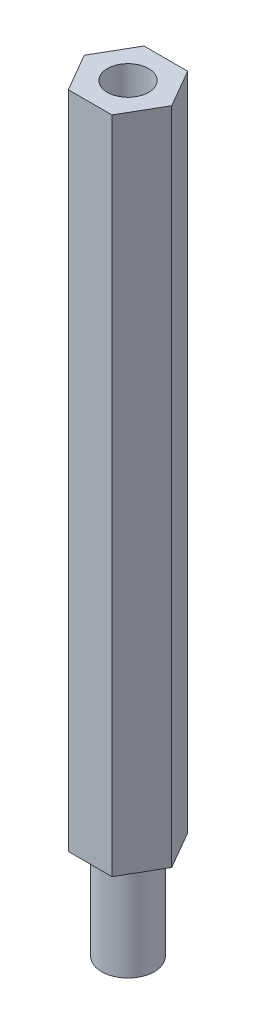
ISO-10303-21;
HEADER;
FILE_DESCRIPTION(('STEP AP214'),'2;1');
FILE_NAME('part.step','',(''),(''),'','','');
FILE_SCHEMA(('AUTOMOTIVE_DESIGN { 1 0 10303 214 1 1 1 1 }'));
ENDSEC;
DATA;
#1=APPLICATION_CONTEXT('core data for automotive mechanical design processes');
#2=APPLICATION_PROTOCOL_DEFINITION('international standard','automotive_design',2000,#1);
#3=PRODUCT_CONTEXT('',#1,'mechanical');
#4=PRODUCT('Part','Part','',(#3));
#5=PRODUCT_RELATED_PRODUCT_CATEGORY('part','',(#4));
#6=PRODUCT_DEFINITION_FORMATION('','',#4);
#7=PRODUCT_DEFINITION_CONTEXT('part definition',#1,'design');
#8=PRODUCT_DEFINITION('design','',#6,#7);
#9=PRODUCT_DEFINITION_SHAPE('','',#8);
#10=(LENGTH_UNIT() NAMED_UNIT(*) SI_UNIT(.MILLI.,.METRE.));
#11=(NAMED_UNIT(*) PLANE_ANGLE_UNIT() SI_UNIT($,.RADIAN.));
#12=(NAMED_UNIT(*) SI_UNIT($,.STERADIAN.) SOLID_ANGLE_UNIT());
#13=UNCERTAINTY_MEASURE_WITH_UNIT(LENGTH_MEASURE(1.E-05),#10,'distance_accuracy_value','');
#14=(GEOMETRIC_REPRESENTATION_CONTEXT(3) GLOBAL_UNCERTAINTY_ASSIGNED_CONTEXT((#13)) GLOBAL_UNIT_ASSIGNED_CONTEXT((#10,
#11,#12)) REPRESENTATION_CONTEXT('',''));
#15=CARTESIAN_POINT('',(0.,0.,0.));
#16=DIRECTION('',(0.,0.,1.));
#17=DIRECTION('',(1.,0.,0.));
#18=AXIS2_PLACEMENT_3D('',#15,#16,#17);
#19=CARTESIAN_POINT('',(-1.325,40.,2.29496732002876));
#20=DIRECTION('',(0.,0.,-1.));
#21=DIRECTION('',(-1.,0.,0.));
#22=AXIS2_PLACEMENT_3D('',#19,#20,#21);
#23=PLANE('',#22);
#24=DIRECTION('',(1.,0.,0.));
#25=VECTOR('',#24,1.);
#26=CARTESIAN_POINT('',(-1.325,0.,2.29496732002876));
#27=LINE('',#26,#25);
#28=CARTESIAN_POINT('',(-1.325,0.,2.29496732002876));
#29=VERTEX_POINT('',#28);
#30=CARTESIAN_POINT('',(1.325,0.,2.29496732002876));
#31=VERTEX_POINT('',#30);
#32=EDGE_CURVE('E122',#29,#31,#27,.T.);
#33=ORIENTED_EDGE('',*,*,#32,.T.);
#34=DIRECTION('',(0.,-1.,0.));
#35=VECTOR('',#34,1.);
#36=CARTESIAN_POINT('',(1.325,40.,2.29496732002876));
#37=LINE('',#36,#35);
#38=CARTESIAN_POINT('',(1.325,40.,2.29496732002876));
#39=VERTEX_POINT('',#38);
#40=EDGE_CURVE('E45',#39,#31,#37,.T.);
#41=ORIENTED_EDGE('',*,*,#40,.F.);
#42=DIRECTION('',(1.,0.,0.));
#43=VECTOR('',#42,1.);
#44=CARTESIAN_POINT('',(-1.325,40.,2.29496732002876));
#45=LINE('',#44,#43);
#46=CARTESIAN_POINT('',(-1.325,40.,2.29496732002876));
#47=VERTEX_POINT('',#46);
#48=EDGE_CURVE('E133',#47,#39,#45,.T.);
#49=ORIENTED_EDGE('',*,*,#48,.F.);
#50=DIRECTION('',(0.,-1.,0.));
#51=VECTOR('',#50,1.);
#52=CARTESIAN_POINT('',(-1.325,40.,2.29496732002876));
#53=LINE('',#52,#51);
#54=EDGE_CURVE('E118',#47,#29,#53,.T.);
#55=ORIENTED_EDGE('',*,*,#54,.T.);
#56=EDGE_LOOP('',(#33,#41,#49,#55));
#57=FACE_BOUND('',#56,.T.);
#58=ADVANCED_FACE('F37',(#57),#23,.F.);
#59=CARTESIAN_POINT('',(1.325,40.,2.29496732002876));
#60=DIRECTION('',(-0.866025403784439,0.,-0.5));
#61=DIRECTION('',(-0.5,0.,0.866025403784439));
#62=AXIS2_PLACEMENT_3D('',#59,#60,#61);
#63=PLANE('',#62);
#64=DIRECTION('',(0.5,0.,-0.866025403784439));
#65=VECTOR('',#64,1.);
#66=CARTESIAN_POINT('',(1.325,0.,2.29496732002876));
#67=LINE('',#66,#65);
#68=CARTESIAN_POINT('',(2.65,0.,0.));
#69=VERTEX_POINT('',#68);
#70=EDGE_CURVE('E125',#31,#69,#67,.T.);
#71=ORIENTED_EDGE('',*,*,#70,.T.);
#72=DIRECTION('',(0.,-1.,0.));
#73=VECTOR('',#72,1.);
#74=CARTESIAN_POINT('',(2.65,40.,0.));
#75=LINE('',#74,#73);
#76=CARTESIAN_POINT('',(2.65,40.,0.));
#77=VERTEX_POINT('',#76);
#78=EDGE_CURVE('E137',#77,#69,#75,.T.);
#79=ORIENTED_EDGE('',*,*,#78,.F.);
#80=DIRECTION('',(0.5,0.,-0.866025403784439));
#81=VECTOR('',#80,1.);
#82=CARTESIAN_POINT('',(1.325,40.,2.29496732002876));
#83=LINE('',#82,#81);
#84=EDGE_CURVE('E91',#39,#77,#83,.T.);
#85=ORIENTED_EDGE('',*,*,#84,.F.);
#86=ORIENTED_EDGE('',*,*,#40,.T.);
#87=EDGE_LOOP('',(#71,#79,#85,#86));
#88=FACE_BOUND('',#87,.T.);
#89=ADVANCED_FACE('F140',(#88),#63,.F.);
#90=CARTESIAN_POINT('',(2.65,40.,0.));
#91=DIRECTION('',(-0.866025403784438,0.,0.5));
#92=DIRECTION('',(0.5,0.,0.866025403784439));
#93=AXIS2_PLACEMENT_3D('',#90,#91,#92);
#94=PLANE('',#93);
#95=DIRECTION('',(-0.5,0.,-0.866025403784439));
#96=VECTOR('',#95,1.);
#97=CARTESIAN_POINT('',(2.65,0.,0.));
#98=LINE('',#97,#96);
#99=CARTESIAN_POINT('',(1.325,0.,-2.29496732002876));
#100=VERTEX_POINT('',#99);
#101=EDGE_CURVE('E128',#69,#100,#98,.T.);
#102=ORIENTED_EDGE('',*,*,#101,.T.);
#103=DIRECTION('',(0.,-1.,0.));
#104=VECTOR('',#103,1.);
#105=CARTESIAN_POINT('',(1.325,40.,-2.29496732002876));
#106=LINE('',#105,#104);
#107=CARTESIAN_POINT('',(1.325,40.,-2.29496732002876));
#108=VERTEX_POINT('',#107);
#109=EDGE_CURVE('E113',#108,#100,#106,.T.);
#110=ORIENTED_EDGE('',*,*,#109,.F.);
#111=DIRECTION('',(-0.5,0.,-0.866025403784439));
#112=VECTOR('',#111,1.);
#113=CARTESIAN_POINT('',(2.65,40.,0.));
#114=LINE('',#113,#112);
#115=EDGE_CURVE('E104',#77,#108,#114,.T.);
#116=ORIENTED_EDGE('',*,*,#115,.F.);
#117=ORIENTED_EDGE('',*,*,#78,.T.);
#118=EDGE_LOOP('',(#102,#110,#116,#117));
#119=FACE_BOUND('',#118,.T.);
#120=ADVANCED_FACE('F148',(#119),#94,.F.);
#121=CARTESIAN_POINT('',(1.325,40.,-2.29496732002876));
#122=DIRECTION('',(0.,0.,1.));
#123=DIRECTION('',(1.,0.,0.));
#124=AXIS2_PLACEMENT_3D('',#121,#122,#123);
#125=PLANE('',#124);
#126=DIRECTION('',(-1.,0.,0.));
#127=VECTOR('',#126,1.);
#128=CARTESIAN_POINT('',(1.325,0.,-2.29496732002876));
#129=LINE('',#128,#127);
#130=CARTESIAN_POINT('',(-1.325,0.,-2.29496732002876));
#131=VERTEX_POINT('',#130);
#132=EDGE_CURVE('E112',#100,#131,#129,.T.);
#133=ORIENTED_EDGE('',*,*,#132,.T.);
#134=DIRECTION('',(0.,-1.,0.));
#135=VECTOR('',#134,1.);
#136=CARTESIAN_POINT('',(-1.325,40.,-2.29496732002876));
#137=LINE('',#136,#135);
#138=CARTESIAN_POINT('',(-1.325,40.,-2.29496732002876));
#139=VERTEX_POINT('',#138);
#140=EDGE_CURVE('E109',#139,#131,#137,.T.);
#141=ORIENTED_EDGE('',*,*,#140,.F.);
#142=DIRECTION('',(-1.,0.,0.));
#143=VECTOR('',#142,1.);
#144=CARTESIAN_POINT('',(1.325,40.,-2.29496732002876));
#145=LINE('',#144,#143);
#146=EDGE_CURVE('E98',#108,#139,#145,.T.);
#147=ORIENTED_EDGE('',*,*,#146,.F.);
#148=ORIENTED_EDGE('',*,*,#109,.T.);
#149=EDGE_LOOP('',(#133,#141,#147,#148));
#150=FACE_BOUND('',#149,.T.);
#151=ADVANCED_FACE('F110',(#150),#125,.F.);
#152=CARTESIAN_POINT('',(-1.325,40.,-2.29496732002876));
#153=DIRECTION('',(0.866025403784439,0.,0.5));
#154=DIRECTION('',(0.5,0.,-0.866025403784439));
#155=AXIS2_PLACEMENT_3D('',#152,#153,#154);
#156=PLANE('',#155);
#157=DIRECTION('',(-0.5,0.,0.866025403784439));
#158=VECTOR('',#157,1.);
#159=CARTESIAN_POINT('',(-1.325,0.,-2.29496732002876));
#160=LINE('',#159,#158);
#161=CARTESIAN_POINT('',(-2.65,0.,0.));
#162=VERTEX_POINT('',#161);
#163=EDGE_CURVE('E76',#131,#162,#160,.T.);
#164=ORIENTED_EDGE('',*,*,#163,.T.);
#165=DIRECTION('',(0.,-1.,0.));
#166=VECTOR('',#165,1.);
#167=CARTESIAN_POINT('',(-2.65,40.,0.));
#168=LINE('',#167,#166);
#169=CARTESIAN_POINT('',(-2.65,40.,0.));
#170=VERTEX_POINT('',#169);
#171=EDGE_CURVE('E114',#170,#162,#168,.T.);
#172=ORIENTED_EDGE('',*,*,#171,.F.);
#173=DIRECTION('',(-0.5,0.,0.866025403784439));
#174=VECTOR('',#173,1.);
#175=CARTESIAN_POINT('',(-1.325,40.,-2.29496732002876));
#176=LINE('',#175,#174);
#177=EDGE_CURVE('E102',#139,#170,#176,.T.);
#178=ORIENTED_EDGE('',*,*,#177,.F.);
#179=ORIENTED_EDGE('',*,*,#140,.T.);
#180=EDGE_LOOP('',(#164,#172,#178,#179));
#181=FACE_BOUND('',#180,.T.);
#182=ADVANCED_FACE('F116',(#181),#156,.F.);
#183=CARTESIAN_POINT('',(-2.65,40.,0.));
#184=DIRECTION('',(0.866025403784438,0.,-0.5));
#185=DIRECTION('',(-0.5,0.,-0.866025403784439));
#186=AXIS2_PLACEMENT_3D('',#183,#184,#185);
#187=PLANE('',#186);
#188=DIRECTION('',(0.5,0.,0.866025403784439));
#189=VECTOR('',#188,1.);
#190=CARTESIAN_POINT('',(-2.65,0.,0.));
#191=LINE('',#190,#189);
#192=EDGE_CURVE('E82',#162,#29,#191,.T.);
#193=ORIENTED_EDGE('',*,*,#192,.T.);
#194=ORIENTED_EDGE('',*,*,#54,.F.);
#195=DIRECTION('',(0.5,0.,0.866025403784439));
#196=VECTOR('',#195,1.);
#197=CARTESIAN_POINT('',(-2.65,40.,0.));
#198=LINE('',#197,#196);
#199=EDGE_CURVE('E53',#170,#47,#198,.T.);
#200=ORIENTED_EDGE('',*,*,#199,.F.);
#201=ORIENTED_EDGE('',*,*,#171,.T.);
#202=EDGE_LOOP('',(#193,#194,#200,#201));
#203=FACE_BOUND('',#202,.T.);
#204=ADVANCED_FACE('F171',(#203),#187,.F.);
#205=CARTESIAN_POINT('',(0.,40.,0.));
#206=DIRECTION('',(0.,1.,0.));
#207=DIRECTION('',(0.,0.,1.));
#208=AXIS2_PLACEMENT_3D('',#205,#206,#207);
#209=PLANE('',#208);
#210=CARTESIAN_POINT('',(0.,40.,0.));
#211=DIRECTION('',(0.,1.,0.));
#212=DIRECTION('',(0.,0.,1.));
#213=AXIS2_PLACEMENT_3D('',#210,#211,#212);
#214=CIRCLE('',#213,1.25);
#215=CARTESIAN_POINT('',(0.,40.,1.25));
#216=VERTEX_POINT('',#215);
#217=EDGE_CURVE('E155',#216,#216,#214,.T.);
#218=ORIENTED_EDGE('',*,*,#217,.F.);
#219=EDGE_LOOP('',(#218));
#220=FACE_BOUND('',#219,.T.);
#221=ORIENTED_EDGE('',*,*,#48,.T.);
#222=ORIENTED_EDGE('',*,*,#84,.T.);
#223=ORIENTED_EDGE('',*,*,#115,.T.);
#224=ORIENTED_EDGE('',*,*,#146,.T.);
#225=ORIENTED_EDGE('',*,*,#177,.T.);
#226=ORIENTED_EDGE('',*,*,#199,.T.);
#227=EDGE_LOOP('',(#221,#222,#223,#224,#225,#226));
#228=FACE_BOUND('',#227,.T.);
#229=ADVANCED_FACE('F100',(#220,#228),#209,.T.);
#230=CARTESIAN_POINT('',(0.,0.,0.));
#231=DIRECTION('',(0.,1.,0.));
#232=DIRECTION('',(0.,0.,1.));
#233=AXIS2_PLACEMENT_3D('',#230,#231,#232);
#234=PLANE('',#233);
#235=CARTESIAN_POINT('',(0.,0.,0.));
#236=DIRECTION('',(0.,1.,0.));
#237=DIRECTION('',(0.,0.,1.));
#238=AXIS2_PLACEMENT_3D('',#235,#236,#237);
#239=CIRCLE('',#238,1.6);
#240=CARTESIAN_POINT('',(0.,0.,1.6));
#241=VERTEX_POINT('',#240);
#242=EDGE_CURVE('E11',#241,#241,#239,.F.);
#243=ORIENTED_EDGE('',*,*,#242,.F.);
#244=EDGE_LOOP('',(#243));
#245=FACE_BOUND('',#244,.T.);
#246=ORIENTED_EDGE('',*,*,#32,.F.);
#247=ORIENTED_EDGE('',*,*,#192,.F.);
#248=ORIENTED_EDGE('',*,*,#163,.F.);
#249=ORIENTED_EDGE('',*,*,#132,.F.);
#250=ORIENTED_EDGE('',*,*,#101,.F.);
#251=ORIENTED_EDGE('',*,*,#70,.F.);
#252=EDGE_LOOP('',(#246,#247,#248,#249,#250,#251));
#253=FACE_BOUND('',#252,.T.);
#254=ADVANCED_FACE('F145',(#245,#253),#234,.F.);
#255=CARTESIAN_POINT('',(0.,-6.,0.));
#256=DIRECTION('',(0.,1.,0.));
#257=DIRECTION('',(0.,0.,1.));
#258=AXIS2_PLACEMENT_3D('',#255,#256,#257);
#259=CYLINDRICAL_SURFACE('',#258,1.6);
#260=CARTESIAN_POINT('',(0.,-6.,0.));
#261=DIRECTION('',(0.,-1.,0.));
#262=DIRECTION('',(0.,0.,-1.));
#263=AXIS2_PLACEMENT_3D('',#260,#261,#262);
#264=CIRCLE('',#263,1.6);
#265=CARTESIAN_POINT('',(0.,-6.,-1.6));
#266=VERTEX_POINT('',#265);
#267=EDGE_CURVE('E126',#266,#266,#264,.T.);
#268=ORIENTED_EDGE('',*,*,#267,.F.);
#269=EDGE_LOOP('',(#268));
#270=FACE_BOUND('',#269,.T.);
#271=ORIENTED_EDGE('',*,*,#242,.T.);
#272=EDGE_LOOP('',(#271));
#273=FACE_BOUND('',#272,.T.);
#274=ADVANCED_FACE('F177',(#270,#273),#259,.T.);
#275=CARTESIAN_POINT('',(0.,-6.,0.));
#276=DIRECTION('',(0.,-1.,0.));
#277=DIRECTION('',(0.,0.,-1.));
#278=AXIS2_PLACEMENT_3D('',#275,#276,#277);
#279=PLANE('',#278);
#280=ORIENTED_EDGE('',*,*,#267,.T.);
#281=EDGE_LOOP('',(#280));
#282=FACE_BOUND('',#281,.T.);
#283=ADVANCED_FACE('F166',(#282),#279,.T.);
#284=CARTESIAN_POINT('',(0.,35.,0.));
#285=DIRECTION('',(0.,1.,0.));
#286=DIRECTION('',(0.,0.,1.));
#287=AXIS2_PLACEMENT_3D('',#284,#285,#286);
#288=CYLINDRICAL_SURFACE('',#287,1.25);
#289=CARTESIAN_POINT('',(0.,35.,0.));
#290=DIRECTION('',(0.,1.,0.));
#291=DIRECTION('',(0.,0.,1.));
#292=AXIS2_PLACEMENT_3D('',#289,#290,#291);
#293=CIRCLE('',#292,1.25);
#294=CARTESIAN_POINT('',(0.,35.,1.25));
#295=VERTEX_POINT('',#294);
#296=EDGE_CURVE('E154',#295,#295,#293,.T.);
#297=ORIENTED_EDGE('',*,*,#296,.F.);
#298=EDGE_LOOP('',(#297));
#299=FACE_BOUND('',#298,.T.);
#300=ORIENTED_EDGE('',*,*,#217,.T.);
#301=EDGE_LOOP('',(#300));
#302=FACE_BOUND('',#301,.T.);
#303=ADVANCED_FACE('F163',(#299,#302),#288,.F.);
#304=CARTESIAN_POINT('',(0.,35.,0.));
#305=DIRECTION('',(0.,1.,0.));
#306=DIRECTION('',(0.,0.,1.));
#307=AXIS2_PLACEMENT_3D('',#304,#305,#306);
#308=PLANE('',#307);
#309=ORIENTED_EDGE('',*,*,#296,.T.);
#310=EDGE_LOOP('',(#309));
#311=FACE_BOUND('',#310,.T.);
#312=ADVANCED_FACE('F161',(#311),#308,.T.);
#313=CLOSED_SHELL('',(#58,#89,#120,#151,#182,#204,#229,#254,#274,#283,#303,#312));
#314=MANIFOLD_SOLID_BREP('B2',#313);
#315=ADVANCED_BREP_SHAPE_REPRESENTATION('',(#18,#314),#14);
#316=SHAPE_DEFINITION_REPRESENTATION(#9,#315);
ENDSEC;
END-ISO-10303-21;
